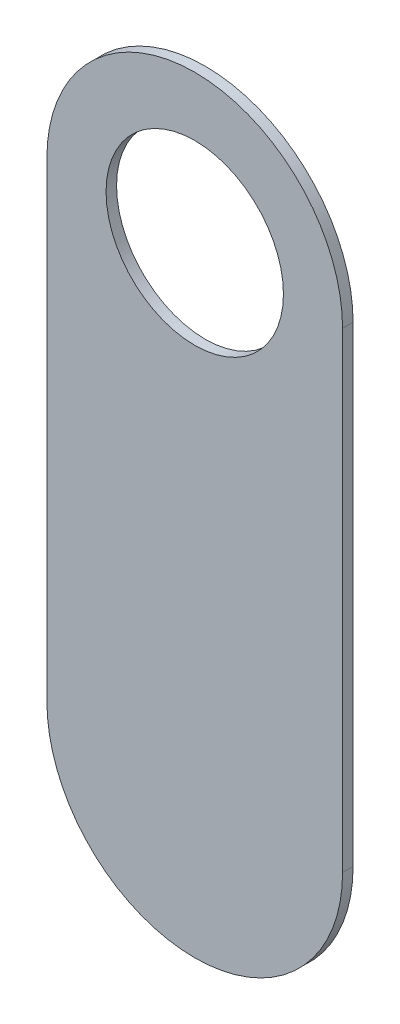
ISO-10303-21;
HEADER;
FILE_DESCRIPTION(('STEP AP214'),'2;1');
FILE_NAME('part.step','',(''),(''),'','','');
FILE_SCHEMA(('AUTOMOTIVE_DESIGN { 1 0 10303 214 1 1 1 1 }'));
ENDSEC;
DATA;
#1=APPLICATION_CONTEXT('core data for automotive mechanical design processes');
#2=APPLICATION_PROTOCOL_DEFINITION('international standard','automotive_design',2000,#1);
#3=PRODUCT_CONTEXT('',#1,'mechanical');
#4=PRODUCT('Part','Part','',(#3));
#5=PRODUCT_RELATED_PRODUCT_CATEGORY('part','',(#4));
#6=PRODUCT_DEFINITION_FORMATION('','',#4);
#7=PRODUCT_DEFINITION_CONTEXT('part definition',#1,'design');
#8=PRODUCT_DEFINITION('design','',#6,#7);
#9=PRODUCT_DEFINITION_SHAPE('','',#8);
#10=(LENGTH_UNIT() NAMED_UNIT(*) SI_UNIT(.MILLI.,.METRE.));
#11=(NAMED_UNIT(*) PLANE_ANGLE_UNIT() SI_UNIT($,.RADIAN.));
#12=(NAMED_UNIT(*) SI_UNIT($,.STERADIAN.) SOLID_ANGLE_UNIT());
#13=UNCERTAINTY_MEASURE_WITH_UNIT(LENGTH_MEASURE(1.E-05),#10,'distance_accuracy_value','');
#14=(GEOMETRIC_REPRESENTATION_CONTEXT(3) GLOBAL_UNCERTAINTY_ASSIGNED_CONTEXT((#13)) GLOBAL_UNIT_ASSIGNED_CONTEXT((#10,
#11,#12)) REPRESENTATION_CONTEXT('',''));
#15=CARTESIAN_POINT('',(0.,0.,0.));
#16=DIRECTION('',(0.,0.,1.));
#17=DIRECTION('',(1.,0.,0.));
#18=AXIS2_PLACEMENT_3D('',#15,#16,#17);
#19=CARTESIAN_POINT('',(57.9400162,76.9058152,0.));
#20=DIRECTION('',(-1.,0.,0.));
#21=DIRECTION('',(0.,1.,0.));
#22=AXIS2_PLACEMENT_3D('',#19,#20,#21);
#23=PLANE('',#22);
#24=DIRECTION('',(0.,1.,0.));
#25=VECTOR('',#24,1.);
#26=CARTESIAN_POINT('',(57.9400162,76.9058152,0.03556));
#27=LINE('',#26,#25);
#28=CARTESIAN_POINT('',(57.9400162,76.9058152,0.03556));
#29=VERTEX_POINT('',#28);
#30=CARTESIAN_POINT('',(57.9400162,78.5000208,0.03556));
#31=VERTEX_POINT('',#30);
#32=EDGE_CURVE('E11',#29,#31,#27,.T.);
#33=ORIENTED_EDGE('',*,*,#32,.F.);
#34=DIRECTION('',(0.,0.,1.));
#35=VECTOR('',#34,1.);
#36=CARTESIAN_POINT('',(57.9400162,76.9058152,0.));
#37=LINE('',#36,#35);
#38=CARTESIAN_POINT('',(57.9400162,76.9058152,0.));
#39=VERTEX_POINT('',#38);
#40=EDGE_CURVE('E24',#39,#29,#37,.T.);
#41=ORIENTED_EDGE('',*,*,#40,.F.);
#42=DIRECTION('',(0.,1.,0.));
#43=VECTOR('',#42,1.);
#44=CARTESIAN_POINT('',(57.9400162,76.9058152,0.));
#45=LINE('',#44,#43);
#46=CARTESIAN_POINT('',(57.9400162,78.5000208,0.));
#47=VERTEX_POINT('',#46);
#48=EDGE_CURVE('E96',#39,#47,#45,.T.);
#49=ORIENTED_EDGE('',*,*,#48,.T.);
#50=DIRECTION('',(0.,0.,1.));
#51=VECTOR('',#50,1.);
#52=CARTESIAN_POINT('',(57.9400162,78.5000208,0.));
#53=LINE('',#52,#51);
#54=EDGE_CURVE('E37',#47,#31,#53,.T.);
#55=ORIENTED_EDGE('',*,*,#54,.T.);
#56=EDGE_LOOP('',(#33,#41,#49,#55));
#57=FACE_BOUND('',#56,.T.);
#58=ADVANCED_FACE('F17',(#57),#23,.F.);
#59=CARTESIAN_POINT('',(57.4400172,76.9058152,0.));
#60=DIRECTION('',(0.,0.,-1.));
#61=DIRECTION('',(-1.,0.,0.));
#62=AXIS2_PLACEMENT_3D('',#59,#60,#61);
#63=CYLINDRICAL_SURFACE('',#62,0.499999);
#64=CARTESIAN_POINT('',(57.4400172,76.9058152,0.03556));
#65=DIRECTION('',(0.,0.,1.));
#66=DIRECTION('',(-1.,0.,0.));
#67=AXIS2_PLACEMENT_3D('',#64,#65,#66);
#68=CIRCLE('',#67,0.499999);
#69=CARTESIAN_POINT('',(56.9400182,76.9058152,0.03556));
#70=VERTEX_POINT('',#69);
#71=EDGE_CURVE('E92',#70,#29,#68,.T.);
#72=ORIENTED_EDGE('',*,*,#71,.F.);
#73=DIRECTION('',(0.,0.,1.));
#74=VECTOR('',#73,1.);
#75=CARTESIAN_POINT('',(56.9400182,76.9058152,0.));
#76=LINE('',#75,#74);
#77=CARTESIAN_POINT('',(56.9400182,76.9058152,0.));
#78=VERTEX_POINT('',#77);
#79=EDGE_CURVE('E90',#78,#70,#76,.T.);
#80=ORIENTED_EDGE('',*,*,#79,.F.);
#81=CARTESIAN_POINT('',(57.4400172,76.9058152,0.));
#82=DIRECTION('',(0.,0.,1.));
#83=DIRECTION('',(-1.,0.,0.));
#84=AXIS2_PLACEMENT_3D('',#81,#82,#83);
#85=CIRCLE('',#84,0.499999);
#86=EDGE_CURVE('E88',#78,#39,#85,.T.);
#87=ORIENTED_EDGE('',*,*,#86,.T.);
#88=ORIENTED_EDGE('',*,*,#40,.T.);
#89=EDGE_LOOP('',(#72,#80,#87,#88));
#90=FACE_BOUND('',#89,.T.);
#91=ADVANCED_FACE('F111',(#90),#63,.T.);
#92=CARTESIAN_POINT('',(57.4400172,78.5000208,0.));
#93=DIRECTION('',(0.,0.,-1.));
#94=DIRECTION('',(1.,0.,0.));
#95=AXIS2_PLACEMENT_3D('',#92,#93,#94);
#96=CYLINDRICAL_SURFACE('',#95,0.499999);
#97=CARTESIAN_POINT('',(57.4400172,78.5000208,0.03556));
#98=DIRECTION('',(0.,0.,1.));
#99=DIRECTION('',(1.,0.,0.));
#100=AXIS2_PLACEMENT_3D('',#97,#98,#99);
#101=CIRCLE('',#100,0.499999);
#102=CARTESIAN_POINT('',(56.9400182,78.5000208,0.03556));
#103=VERTEX_POINT('',#102);
#104=EDGE_CURVE('E85',#31,#103,#101,.T.);
#105=ORIENTED_EDGE('',*,*,#104,.F.);
#106=ORIENTED_EDGE('',*,*,#54,.F.);
#107=CARTESIAN_POINT('',(57.4400172,78.5000208,0.));
#108=DIRECTION('',(0.,0.,1.));
#109=DIRECTION('',(1.,0.,0.));
#110=AXIS2_PLACEMENT_3D('',#107,#108,#109);
#111=CIRCLE('',#110,0.499999);
#112=CARTESIAN_POINT('',(56.9400182,78.5000208,0.));
#113=VERTEX_POINT('',#112);
#114=EDGE_CURVE('E82',#47,#113,#111,.T.);
#115=ORIENTED_EDGE('',*,*,#114,.T.);
#116=DIRECTION('',(0.,0.,1.));
#117=VECTOR('',#116,1.);
#118=CARTESIAN_POINT('',(56.9400182,78.5000208,0.));
#119=LINE('',#118,#117);
#120=EDGE_CURVE('E80',#113,#103,#119,.T.);
#121=ORIENTED_EDGE('',*,*,#120,.T.);
#122=EDGE_LOOP('',(#105,#106,#115,#121));
#123=FACE_BOUND('',#122,.T.);
#124=ADVANCED_FACE('F104',(#123),#96,.T.);
#125=CARTESIAN_POINT('',(56.9400182,78.5000208,0.));
#126=DIRECTION('',(1.,0.,0.));
#127=DIRECTION('',(0.,-1.,0.));
#128=AXIS2_PLACEMENT_3D('',#125,#126,#127);
#129=PLANE('',#128);
#130=DIRECTION('',(0.,-1.,0.));
#131=VECTOR('',#130,1.);
#132=CARTESIAN_POINT('',(56.9400182,78.5000208,0.03556));
#133=LINE('',#132,#131);
#134=EDGE_CURVE('E77',#103,#70,#133,.T.);
#135=ORIENTED_EDGE('',*,*,#134,.F.);
#136=ORIENTED_EDGE('',*,*,#120,.F.);
#137=DIRECTION('',(0.,-1.,0.));
#138=VECTOR('',#137,1.);
#139=CARTESIAN_POINT('',(56.9400182,78.5000208,0.));
#140=LINE('',#139,#138);
#141=EDGE_CURVE('E68',#113,#78,#140,.T.);
#142=ORIENTED_EDGE('',*,*,#141,.T.);
#143=ORIENTED_EDGE('',*,*,#79,.T.);
#144=EDGE_LOOP('',(#135,#136,#142,#143));
#145=FACE_BOUND('',#144,.T.);
#146=ADVANCED_FACE('F110',(#145),#129,.F.);
#147=CARTESIAN_POINT('',(57.4400172,78.5000208,0.));
#148=DIRECTION('',(0.,0.,-1.));
#149=DIRECTION('',(1.,0.,0.));
#150=AXIS2_PLACEMENT_3D('',#147,#148,#149);
#151=CYLINDRICAL_SURFACE('',#150,0.2999994);
#152=DIRECTION('',(0.,0.,1.));
#153=VECTOR('',#152,1.);
#154=CARTESIAN_POINT('',(57.7400166,78.5000208,0.));
#155=LINE('',#154,#153);
#156=CARTESIAN_POINT('',(57.7400166,78.5000208,0.));
#157=VERTEX_POINT('',#156);
#158=CARTESIAN_POINT('',(57.7400166,78.5000208,0.03556));
#159=VERTEX_POINT('',#158);
#160=EDGE_CURVE('E62',#157,#159,#155,.T.);
#161=ORIENTED_EDGE('',*,*,#160,.T.);
#162=CARTESIAN_POINT('',(57.4400172,78.5000208,0.03556));
#163=DIRECTION('',(0.,0.,1.));
#164=DIRECTION('',(1.,0.,0.));
#165=AXIS2_PLACEMENT_3D('',#162,#163,#164);
#166=CIRCLE('',#165,0.2999994);
#167=EDGE_CURVE('E67',#159,#159,#166,.T.);
#168=ORIENTED_EDGE('',*,*,#167,.T.);
#169=ORIENTED_EDGE('',*,*,#160,.F.);
#170=CARTESIAN_POINT('',(57.4400172,78.5000208,0.));
#171=DIRECTION('',(0.,0.,1.));
#172=DIRECTION('',(1.,0.,0.));
#173=AXIS2_PLACEMENT_3D('',#170,#171,#172);
#174=CIRCLE('',#173,0.2999994);
#175=EDGE_CURVE('E65',#157,#157,#174,.T.);
#176=ORIENTED_EDGE('',*,*,#175,.F.);
#177=EDGE_LOOP('',(#161,#168,#169,#176));
#178=FACE_BOUND('',#177,.T.);
#179=ADVANCED_FACE('F64',(#178),#151,.F.);
#180=CARTESIAN_POINT('',(57.9400162,76.9058152,0.));
#181=DIRECTION('',(0.,0.,-1.));
#182=DIRECTION('',(-1.,0.,0.));
#183=AXIS2_PLACEMENT_3D('',#180,#181,#182);
#184=PLANE('',#183);
#185=ORIENTED_EDGE('',*,*,#48,.F.);
#186=ORIENTED_EDGE('',*,*,#86,.F.);
#187=ORIENTED_EDGE('',*,*,#141,.F.);
#188=ORIENTED_EDGE('',*,*,#114,.F.);
#189=EDGE_LOOP('',(#185,#186,#187,#188));
#190=FACE_BOUND('',#189,.T.);
#191=ORIENTED_EDGE('',*,*,#175,.T.);
#192=EDGE_LOOP('',(#191));
#193=FACE_BOUND('',#192,.T.);
#194=ADVANCED_FACE('F71',(#190,#193),#184,.T.);
#195=CARTESIAN_POINT('',(57.9400162,76.9058152,0.03556));
#196=DIRECTION('',(0.,0.,-1.));
#197=DIRECTION('',(-1.,0.,0.));
#198=AXIS2_PLACEMENT_3D('',#195,#196,#197);
#199=PLANE('',#198);
#200=ORIENTED_EDGE('',*,*,#134,.T.);
#201=ORIENTED_EDGE('',*,*,#71,.T.);
#202=ORIENTED_EDGE('',*,*,#32,.T.);
#203=ORIENTED_EDGE('',*,*,#104,.T.);
#204=EDGE_LOOP('',(#200,#201,#202,#203));
#205=FACE_BOUND('',#204,.T.);
#206=ORIENTED_EDGE('',*,*,#167,.F.);
#207=EDGE_LOOP('',(#206));
#208=FACE_BOUND('',#207,.T.);
#209=ADVANCED_FACE('F107',(#205,#208),#199,.F.);
#210=CLOSED_SHELL('',(#58,#91,#124,#146,#179,#194,#209));
#211=MANIFOLD_SOLID_BREP('B1',#210);
#212=ADVANCED_BREP_SHAPE_REPRESENTATION('',(#18,#211),#14);
#213=SHAPE_DEFINITION_REPRESENTATION(#9,#212);
ENDSEC;
END-ISO-10303-21;
